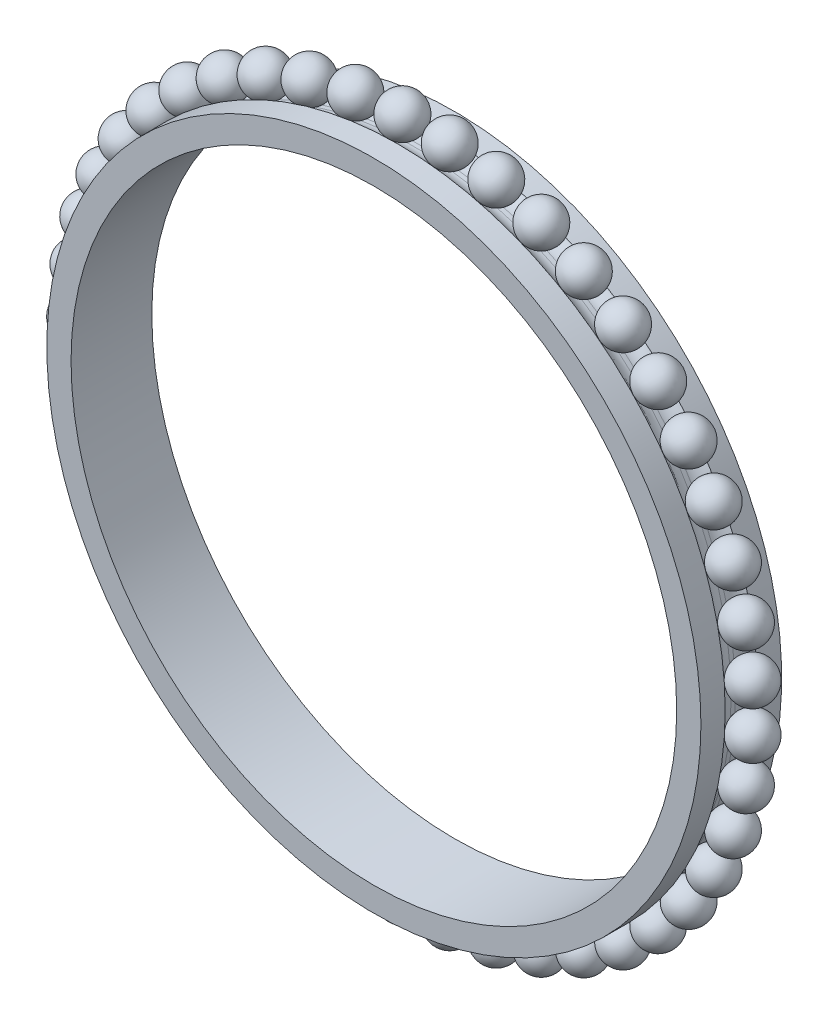
ISO-10303-21;
HEADER;
FILE_DESCRIPTION(('STEP AP214'),'2;1');
FILE_NAME('part.step','',(''),(''),'','','');
FILE_SCHEMA(('AUTOMOTIVE_DESIGN { 1 0 10303 214 1 1 1 1 }'));
ENDSEC;
DATA;
#1=APPLICATION_CONTEXT('core data for automotive mechanical design processes');
#2=APPLICATION_PROTOCOL_DEFINITION('international standard','automotive_design',2000,#1);
#3=PRODUCT_CONTEXT('',#1,'mechanical');
#4=PRODUCT('Part','Part','',(#3));
#5=PRODUCT_RELATED_PRODUCT_CATEGORY('part','',(#4));
#6=PRODUCT_DEFINITION_FORMATION('','',#4);
#7=PRODUCT_DEFINITION_CONTEXT('part definition',#1,'design');
#8=PRODUCT_DEFINITION('design','',#6,#7);
#9=PRODUCT_DEFINITION_SHAPE('','',#8);
#10=(LENGTH_UNIT() NAMED_UNIT(*) SI_UNIT(.MILLI.,.METRE.));
#11=(NAMED_UNIT(*) PLANE_ANGLE_UNIT() SI_UNIT($,.RADIAN.));
#12=(NAMED_UNIT(*) SI_UNIT($,.STERADIAN.) SOLID_ANGLE_UNIT());
#13=UNCERTAINTY_MEASURE_WITH_UNIT(LENGTH_MEASURE(1.E-05),#10,'distance_accuracy_value','');
#14=(GEOMETRIC_REPRESENTATION_CONTEXT(3) GLOBAL_UNCERTAINTY_ASSIGNED_CONTEXT((#13)) GLOBAL_UNIT_ASSIGNED_CONTEXT((#10,
#11,#12)) REPRESENTATION_CONTEXT('',''));
#15=CARTESIAN_POINT('',(0.,0.,0.));
#16=DIRECTION('',(0.,0.,1.));
#17=DIRECTION('',(1.,0.,0.));
#18=AXIS2_PLACEMENT_3D('',#15,#16,#17);
#19=CARTESIAN_POINT('',(-41.5912588871461,-5.84527024032162,5.));
#20=DIRECTION('',(-0.139173100960039,0.990268068741574,0.));
#21=DIRECTION('',(0.990268068741574,0.139173100960039,0.));
#22=AXIS2_PLACEMENT_3D('',#19,#20,#21);
#23=SPHERICAL_SURFACE('',#22,2.49999999999999);
#24=CARTESIAN_POINT('',(-39.1155887152922,-5.49733748792153,5.));
#25=VERTEX_POINT('',#24);
#26=VERTEX_LOOP('',#25);
#27=FACE_BOUND('',#26,.T.);
#28=CARTESIAN_POINT('',(-40.1058567840338,-5.63651058888157,7.00000000000001));
#29=VERTEX_POINT('',#28);
#30=VERTEX_LOOP('',#29);
#31=FACE_BOUND('',#30,.T.);
#32=CARTESIAN_POINT('',(-40.1058567840338,-5.63651058888156,3.));
#33=VERTEX_POINT('',#32);
#34=VERTEX_LOOP('',#33);
#35=FACE_BOUND('',#34,.T.);
#36=ADVANCED_FACE('F39',(#27,#31,#35),#23,.T.);
#37=CLOSED_SHELL('',(#36));
#38=MANIFOLD_SOLID_BREP('B2',#37);
#39=CARTESIAN_POINT('',(-40.3729912294097,-11.5767689443129,5.));
#40=DIRECTION('',(-0.275637355816974,0.961261695938326,0.));
#41=DIRECTION('',(0.961261695938326,0.275637355816974,0.));
#42=AXIS2_PLACEMENT_3D('',#39,#40,#41);
#43=SPHERICAL_SURFACE('',#42,2.49999999999999);
#44=CARTESIAN_POINT('',(-37.9698369895639,-10.8876755547705,5.));
#45=VERTEX_POINT('',#44);
#46=VERTEX_LOOP('',#45);
#47=FACE_BOUND('',#46,.T.);
#48=CARTESIAN_POINT('',(-38.9310986855022,-11.1633129105875,7.00000000000001));
#49=VERTEX_POINT('',#48);
#50=VERTEX_LOOP('',#49);
#51=FACE_BOUND('',#50,.T.);
#52=CARTESIAN_POINT('',(-38.9310986855022,-11.1633129105875,3.));
#53=VERTEX_POINT('',#52);
#54=VERTEX_LOOP('',#53);
#55=FACE_BOUND('',#54,.T.);
#56=ADVANCED_FACE('F69',(#47,#51,#55),#43,.T.);
#57=CLOSED_SHELL('',(#56));
#58=MANIFOLD_SOLID_BREP('B6',#57);
#59=CARTESIAN_POINT('',(-38.3689092209897,-17.0829390091826,5.));
#60=DIRECTION('',(-0.406736643075777,0.913545457642611,0.));
#61=DIRECTION('',(0.913545457642611,0.406736643075777,0.));
#62=AXIS2_PLACEMENT_3D('',#59,#60,#61);
#63=SPHERICAL_SURFACE('',#62,2.49999999999999);
#64=CARTESIAN_POINT('',(-36.0850455768831,-16.0660974014932,5.));
#65=VERTEX_POINT('',#64);
#66=VERTEX_LOOP('',#65);
#67=FACE_BOUND('',#66,.T.);
#68=CARTESIAN_POINT('',(-36.9985910345258,-16.472834044569,7.00000000000001));
#69=VERTEX_POINT('',#68);
#70=VERTEX_LOOP('',#69);
#71=FACE_BOUND('',#70,.T.);
#72=CARTESIAN_POINT('',(-36.9985910345258,-16.472834044569,3.));
#73=VERTEX_POINT('',#72);
#74=VERTEX_LOOP('',#73);
#75=FACE_BOUND('',#74,.T.);
#76=ADVANCED_FACE('F99',(#67,#71,#75),#63,.T.);
#77=CLOSED_SHELL('',(#76));
#78=MANIFOLD_SOLID_BREP('B33',#77);
#79=CARTESIAN_POINT('',(-35.6180200385704,-22.2566090977937,5.));
#80=DIRECTION('',(-0.529919264233184,0.848048096156439,0.));
#81=DIRECTION('',(0.848048096156439,0.529919264233184,0.));
#82=AXIS2_PLACEMENT_3D('',#79,#80,#81);
#83=SPHERICAL_SURFACE('',#82,2.49999999999999);
#84=CARTESIAN_POINT('',(-33.4978997981794,-20.9318109372108,5.));
#85=VERTEX_POINT('',#84);
#86=VERTEX_LOOP('',#85);
#87=FACE_BOUND('',#86,.T.);
#88=CARTESIAN_POINT('',(-34.3459478943358,-21.461730201444,7.00000000000001));
#89=VERTEX_POINT('',#88);
#90=VERTEX_LOOP('',#89);
#91=FACE_BOUND('',#90,.T.);
#92=CARTESIAN_POINT('',(-34.3459478943358,-21.461730201444,3.));
#93=VERTEX_POINT('',#92);
#94=VERTEX_LOOP('',#93);
#95=FACE_BOUND('',#94,.T.);
#96=ADVANCED_FACE('F129',(#87,#91,#95),#83,.T.);
#97=CLOSED_SHELL('',(#96));
#98=MANIFOLD_SOLID_BREP('B63',#97);
#99=CARTESIAN_POINT('',(-32.1738666109977,-26.9970796068339,5.));
#100=DIRECTION('',(-0.642787609686521,0.766044443118994,0.));
#101=DIRECTION('',(0.766044443118994,0.642787609686521,0.));
#102=AXIS2_PLACEMENT_3D('',#99,#100,#101);
#103=SPHERICAL_SURFACE('',#102,2.49999999999999);
#104=CARTESIAN_POINT('',(-30.2587555032003,-25.3901105826176,5.));
#105=VERTEX_POINT('',#104);
#106=VERTEX_LOOP('',#105);
#107=FACE_BOUND('',#106,.T.);
#108=CARTESIAN_POINT('',(-31.0247999463193,-26.0328981923041,7.00000000000001));
#109=VERTEX_POINT('',#108);
#110=VERTEX_LOOP('',#109);
#111=FACE_BOUND('',#110,.T.);
#112=CARTESIAN_POINT('',(-31.0247999463193,-26.0328981923041,3.));
#113=VERTEX_POINT('',#112);
#114=VERTEX_LOOP('',#113);
#115=FACE_BOUND('',#114,.T.);
#116=ADVANCED_FACE('F159',(#107,#111,#115),#103,.T.);
#117=CLOSED_SHELL('',(#116));
#118=MANIFOLD_SOLID_BREP('B93',#117);
#119=CARTESIAN_POINT('',(-28.1034854670728,-31.2120826700499,5.));
#120=DIRECTION('',(-0.743144825477378,0.669130606358876,0.));
#121=DIRECTION('',(0.669130606358876,0.743144825477378,0.));
#122=AXIS2_PLACEMENT_3D('',#119,#120,#121);
#123=SPHERICAL_SURFACE('',#122,2.49999999999999);
#124=CARTESIAN_POINT('',(-26.4306589511756,-29.3542206063565,5.));
#125=VERTEX_POINT('',#124);
#126=VERTEX_LOOP('',#125);
#127=FACE_BOUND('',#126,.T.);
#128=CARTESIAN_POINT('',(-27.0997895575345,-30.0973654318338,7.00000000000001));
#129=VERTEX_POINT('',#128);
#130=VERTEX_LOOP('',#129);
#131=FACE_BOUND('',#130,.T.);
#132=CARTESIAN_POINT('',(-27.0997895575345,-30.0973654318338,3.));
#133=VERTEX_POINT('',#132);
#134=VERTEX_LOOP('',#133);
#135=FACE_BOUND('',#134,.T.);
#136=ADVANCED_FACE('F189',(#127,#131,#135),#123,.T.);
#137=CLOSED_SHELL('',(#136));
#138=MANIFOLD_SOLID_BREP('B123',#137);
#139=CARTESIAN_POINT('',(-23.4861019457722,-34.8195780473112,5.));
#140=DIRECTION('',(-0.829037572555029,0.559192903470766,0.));
#141=DIRECTION('',(0.559192903470766,0.829037572555029,0.));
#142=AXIS2_PLACEMENT_3D('',#139,#140,#141);
#143=SPHERICAL_SURFACE('',#142,2.49999999999999);
#144=CARTESIAN_POINT('',(-22.0881196870953,-32.7469841159236,5.));
#145=VERTEX_POINT('',#144);
#146=VERTEX_LOOP('',#145);
#147=FACE_BOUND('',#146,.T.);
#148=CARTESIAN_POINT('',(-22.647312590566,-33.5760216884787,7.00000000000001));
#149=VERTEX_POINT('',#148);
#150=VERTEX_LOOP('',#149);
#151=FACE_BOUND('',#150,.T.);
#152=CARTESIAN_POINT('',(-22.647312590566,-33.5760216884787,3.));
#153=VERTEX_POINT('',#152);
#154=VERTEX_LOOP('',#153);
#155=FACE_BOUND('',#154,.T.);
#156=ADVANCED_FACE('F219',(#147,#151,#155),#143,.T.);
#157=CLOSED_SHELL('',(#156));
#158=MANIFOLD_SOLID_BREP('B153',#157);
#159=CARTESIAN_POINT('',(-18.4115881651421,-37.7493499445646,5.));
#160=DIRECTION('',(-0.898794046299157,0.438371146789097,0.));
#161=DIRECTION('',(0.438371146789097,0.898794046299157,0.));
#162=AXIS2_PLACEMENT_3D('',#159,#160,#161);
#163=SPHERICAL_SURFACE('',#162,2.49999999999999);
#164=CARTESIAN_POINT('',(-17.3156602981693,-35.5023648288167,5.));
#165=VERTEX_POINT('',#164);
#166=VERTEX_LOOP('',#165);
#167=FACE_BOUND('',#166,.T.);
#168=CARTESIAN_POINT('',(-17.7540314449585,-36.4011588751159,7.00000000000001));
#169=VERTEX_POINT('',#168);
#170=VERTEX_LOOP('',#169);
#171=FACE_BOUND('',#170,.T.);
#172=CARTESIAN_POINT('',(-17.7540314449584,-36.4011588751159,3.));
#173=VERTEX_POINT('',#172);
#174=VERTEX_LOOP('',#173);
#175=FACE_BOUND('',#174,.T.);
#176=ADVANCED_FACE('F249',(#167,#171,#175),#163,.T.);
#177=CLOSED_SHELL('',(#176));
#178=MANIFOLD_SOLID_BREP('B183',#177);
#179=CARTESIAN_POINT('',(-12.9787137637487,-39.9443736843962,5.));
#180=DIRECTION('',(-0.951056516295147,0.309016994374968,0.));
#181=DIRECTION('',(0.309016994374968,0.951056516295147,0.));
#182=AXIS2_PLACEMENT_3D('',#179,#180,#181);
#183=SPHERICAL_SURFACE('',#182,2.49999999999999);
#184=CARTESIAN_POINT('',(-12.2061712778113,-37.5667323936583,5.));
#185=VERTEX_POINT('',#184);
#186=VERTEX_LOOP('',#185);
#187=FACE_BOUND('',#186,.T.);
#188=CARTESIAN_POINT('',(-12.5151882721862,-38.5177889099535,7.00000000000001));
#189=VERTEX_POINT('',#188);
#190=VERTEX_LOOP('',#189);
#191=FACE_BOUND('',#190,.T.);
#192=CARTESIAN_POINT('',(-12.5151882721862,-38.5177889099534,3.));
#193=VERTEX_POINT('',#192);
#194=VERTEX_LOOP('',#193);
#195=FACE_BOUND('',#194,.T.);
#196=ADVANCED_FACE('F279',(#187,#191,#195),#183,.T.);
#197=CLOSED_SHELL('',(#196));
#198=MANIFOLD_SOLID_BREP('B213',#197);
#199=CARTESIAN_POINT('',(-7.29322346201194,-41.3619256265126,5.));
#200=DIRECTION('',(-0.984807753012204,0.173648177666951,0.));
#201=DIRECTION('',(0.173648177666951,0.984807753012204,0.));
#202=AXIS2_PLACEMENT_3D('',#199,#200,#201);
#203=SPHERICAL_SURFACE('',#202,2.49999999999999);
#204=CARTESIAN_POINT('',(-6.85910301784456,-38.8999062439821,5.));
#205=VERTEX_POINT('',#204);
#206=VERTEX_LOOP('',#205);
#207=FACE_BOUND('',#206,.T.);
#208=CARTESIAN_POINT('',(-7.03275119551152,-39.8847139969943,7.00000000000001));
#209=VERTEX_POINT('',#208);
#210=VERTEX_LOOP('',#209);
#211=FACE_BOUND('',#210,.T.);
#212=CARTESIAN_POINT('',(-7.03275119551151,-39.8847139969943,3.));
#213=VERTEX_POINT('',#212);
#214=VERTEX_LOOP('',#213);
#215=FACE_BOUND('',#214,.T.);
#216=ADVANCED_FACE('F309',(#207,#211,#215),#203,.T.);
#217=CLOSED_SHELL('',(#216));
#218=MANIFOLD_SOLID_BREP('B243',#217);
#219=CARTESIAN_POINT('',(-1.46577886150591,-41.974414734802,5.));
#220=DIRECTION('',(-0.999390827019095,0.0348994967025217,0.));
#221=DIRECTION('',(0.0348994967025217,0.999390827019095,0.));
#222=AXIS2_PLACEMENT_3D('',#219,#220,#221);
#223=SPHERICAL_SURFACE('',#222,2.49999999999999);
#224=CARTESIAN_POINT('',(-1.37853011974961,-39.4759376672543,5.));
#225=VERTEX_POINT('',#224);
#226=VERTEX_LOOP('',#225);
#227=FACE_BOUND('',#226,.T.);
#228=CARTESIAN_POINT('',(-1.41342961645213,-40.4753284942734,7.00000000000001));
#229=VERTEX_POINT('',#228);
#230=VERTEX_LOOP('',#229);
#231=FACE_BOUND('',#230,.T.);
#232=CARTESIAN_POINT('',(-1.41342961645213,-40.4753284942733,3.));
#233=VERTEX_POINT('',#232);
#234=VERTEX_LOOP('',#233);
#235=FACE_BOUND('',#234,.T.);
#236=ADVANCED_FACE('F339',(#227,#231,#235),#223,.T.);
#237=CLOSED_SHELL('',(#236));
#238=MANIFOLD_SOLID_BREP('B273',#237);
#239=CARTESIAN_POINT('',(4.39019545724062,-41.7699196054676,5.));
#240=DIRECTION('',(-0.994521895368275,-0.104528463267634,0.));
#241=DIRECTION('',(-0.104528463267634,0.994521895368275,0.));
#242=AXIS2_PLACEMENT_3D('',#239,#240,#241);
#243=SPHERICAL_SURFACE('',#242,2.49999999999999);
#244=CARTESIAN_POINT('',(4.12887429907154,-39.2836148670469,5.));
#245=VERTEX_POINT('',#244);
#246=VERTEX_LOOP('',#245);
#247=FACE_BOUND('',#246,.T.);
#248=CARTESIAN_POINT('',(4.23340276233917,-40.2781367624152,7.00000000000001));
#249=VERTEX_POINT('',#248);
#250=VERTEX_LOOP('',#249);
#251=FACE_BOUND('',#250,.T.);
#252=CARTESIAN_POINT('',(4.23340276233917,-40.2781367624152,3.));
#253=VERTEX_POINT('',#252);
#254=VERTEX_LOOP('',#253);
#255=FACE_BOUND('',#254,.T.);
#256=ADVANCED_FACE('F369',(#247,#251,#255),#243,.T.);
#257=CLOSED_SHELL('',(#256));
#258=MANIFOLD_SOLID_BREP('B303',#257);
#259=CARTESIAN_POINT('',(10.1607196151853,-40.7524205035921,5.));
#260=DIRECTION('',(-0.970295726276001,-0.241921895599649,0.));
#261=DIRECTION('',(-0.241921895599649,0.970295726276001,0.));
#262=AXIS2_PLACEMENT_3D('',#259,#260,#261);
#263=SPHERICAL_SURFACE('',#262,2.49999999999999);
#264=CARTESIAN_POINT('',(9.55591487618613,-38.3266811879021,5.));
#265=VERTEX_POINT('',#264);
#266=VERTEX_LOOP('',#265);
#267=FACE_BOUND('',#266,.T.);
#268=CARTESIAN_POINT('',(9.79783677178578,-39.2969769141781,7.00000000000001));
#269=VERTEX_POINT('',#268);
#270=VERTEX_LOOP('',#269);
#271=FACE_BOUND('',#270,.T.);
#272=CARTESIAN_POINT('',(9.79783677178578,-39.2969769141781,3.));
#273=VERTEX_POINT('',#272);
#274=VERTEX_LOOP('',#273);
#275=FACE_BOUND('',#274,.T.);
#276=ADVANCED_FACE('F399',(#267,#271,#275),#263,.T.);
#277=CLOSED_SHELL('',(#276));
#278=MANIFOLD_SOLID_BREP('B333',#277);
#279=CARTESIAN_POINT('',(15.7334769234676,-38.9417218918054,5.));
#280=DIRECTION('',(-0.927183854566795,-0.374606593415894,0.));
#281=DIRECTION('',(-0.374606593415894,0.927183854566795,0.));
#282=AXIS2_PLACEMENT_3D('',#279,#280,#281);
#283=SPHERICAL_SURFACE('',#282,2.49999999999999);
#284=CARTESIAN_POINT('',(14.7969604399278,-36.6237622553884,5.));
#285=VERTEX_POINT('',#284);
#286=VERTEX_LOOP('',#285);
#287=FACE_BOUND('',#286,.T.);
#288=CARTESIAN_POINT('',(15.1715670333437,-37.5509461099552,7.00000000000001));
#289=VERTEX_POINT('',#288);
#290=VERTEX_LOOP('',#289);
#291=FACE_BOUND('',#290,.T.);
#292=CARTESIAN_POINT('',(15.1715670333437,-37.5509461099552,3.));
#293=VERTEX_POINT('',#292);
#294=VERTEX_LOOP('',#293);
#295=FACE_BOUND('',#294,.T.);
#296=ADVANCED_FACE('F429',(#287,#291,#295),#283,.T.);
#297=CLOSED_SHELL('',(#296));
#298=MANIFOLD_SOLID_BREP('B363',#297);
#299=CARTESIAN_POINT('',(20.9999999999993,-36.3730669589468,5.));
#300=DIRECTION('',(-0.866025403784448,-0.499999999999984,0.));
#301=DIRECTION('',(-0.499999999999984,0.866025403784448,0.));
#302=AXIS2_PLACEMENT_3D('',#299,#300,#301);
#303=SPHERICAL_SURFACE('',#302,2.49999999999999);
#304=CARTESIAN_POINT('',(19.7499999999994,-34.2080034494857,5.));
#305=VERTEX_POINT('',#304);
#306=VERTEX_LOOP('',#305);
#307=FACE_BOUND('',#306,.T.);
#308=CARTESIAN_POINT('',(20.2499999999994,-35.0740288532702,7.00000000000001));
#309=VERTEX_POINT('',#308);
#310=VERTEX_LOOP('',#309);
#311=FACE_BOUND('',#310,.T.);
#312=CARTESIAN_POINT('',(20.2499999999994,-35.0740288532701,3.));
#313=VERTEX_POINT('',#312);
#314=VERTEX_LOOP('',#313);
#315=FACE_BOUND('',#314,.T.);
#316=ADVANCED_FACE('F459',(#307,#311,#315),#303,.T.);
#317=CLOSED_SHELL('',(#316));
#318=MANIFOLD_SOLID_BREP('B393',#317);
#319=CARTESIAN_POINT('',(25.8577819636771,-33.0964516514828,5.));
#320=DIRECTION('',(-0.788010753606733,-0.615661475325644,0.));
#321=DIRECTION('',(-0.615661475325644,0.788010753606733,0.));
#322=AXIS2_PLACEMENT_3D('',#319,#320,#321);
#323=SPHERICAL_SURFACE('',#322,2.49999999999999);
#324=CARTESIAN_POINT('',(24.3186282753629,-31.126424767466,5.));
#325=VERTEX_POINT('',#324);
#326=VERTEX_LOOP('',#325);
#327=FACE_BOUND('',#326,.T.);
#328=CARTESIAN_POINT('',(24.9342897506886,-31.9144355210727,7.00000000000001));
#329=VERTEX_POINT('',#328);
#330=VERTEX_LOOP('',#329);
#331=FACE_BOUND('',#330,.T.);
#332=CARTESIAN_POINT('',(24.9342897506886,-31.9144355210727,3.));
#333=VERTEX_POINT('',#332);
#334=VERTEX_LOOP('',#333);
#335=FACE_BOUND('',#334,.T.);
#336=ADVANCED_FACE('F489',(#327,#331,#335),#323,.T.);
#337=CLOSED_SHELL('',(#336));
#338=MANIFOLD_SOLID_BREP('B423',#337);
#339=CARTESIAN_POINT('',(30.2122716142229,-29.1756515592784,5.));
#340=DIRECTION('',(-0.694658370459009,-0.719339800338639,0.));
#341=DIRECTION('',(-0.719339800338639,0.694658370459009,0.));
#342=AXIS2_PLACEMENT_3D('',#339,#340,#341);
#343=SPHERICAL_SURFACE('',#342,2.49999999999999);
#344=CARTESIAN_POINT('',(28.4139221133763,-27.4390056331309,5.));
#345=VERTEX_POINT('',#344);
#346=VERTEX_LOOP('',#345);
#347=FACE_BOUND('',#346,.T.);
#348=CARTESIAN_POINT('',(29.1332619137149,-28.1336640035899,7.00000000000001));
#349=VERTEX_POINT('',#348);
#350=VERTEX_LOOP('',#349);
#351=FACE_BOUND('',#350,.T.);
#352=CARTESIAN_POINT('',(29.1332619137149,-28.1336640035899,3.));
#353=VERTEX_POINT('',#352);
#354=VERTEX_LOOP('',#353);
#355=FACE_BOUND('',#354,.T.);
#356=ADVANCED_FACE('F519',(#347,#351,#355),#343,.T.);
#357=CLOSED_SHELL('',(#356));
#358=MANIFOLD_SOLID_BREP('B453',#357);
#359=CARTESIAN_POINT('',(33.9787137637474,-24.6869805962844,5.));
#360=DIRECTION('',(-0.587785252292486,-0.809016994374938,0.));
#361=DIRECTION('',(-0.809016994374938,0.587785252292486,0.));
#362=AXIS2_PLACEMENT_3D('',#359,#360,#361);
#363=SPHERICAL_SURFACE('',#362,2.49999999999999);
#364=CARTESIAN_POINT('',(31.95617127781,-23.2175174655532,5.));
#365=VERTEX_POINT('',#364);
#366=VERTEX_LOOP('',#365);
#367=FACE_BOUND('',#366,.T.);
#368=CARTESIAN_POINT('',(32.765188272185,-23.8053027178457,7.00000000000001));
#369=VERTEX_POINT('',#368);
#370=VERTEX_LOOP('',#369);
#371=FACE_BOUND('',#370,.T.);
#372=CARTESIAN_POINT('',(32.765188272185,-23.8053027178457,3.));
#373=VERTEX_POINT('',#372);
#374=VERTEX_LOOP('',#373);
#375=FACE_BOUND('',#374,.T.);
#376=ADVANCED_FACE('F549',(#367,#371,#375),#363,.T.);
#377=CLOSED_SHELL('',(#376));
#378=MANIFOLD_SOLID_BREP('B483',#377);
#379=CARTESIAN_POINT('',(37.0837989000746,-19.717805637008,5.));
#380=DIRECTION('',(-0.469471562785905,-0.88294759285892,0.));
#381=DIRECTION('',(-0.88294759285892,0.469471562785905,0.));
#382=AXIS2_PLACEMENT_3D('',#379,#380,#381);
#383=SPHERICAL_SURFACE('',#382,2.49999999999999);
#384=CARTESIAN_POINT('',(34.8764299179273,-18.5441267300432,5.));
#385=VERTEX_POINT('',#384);
#386=VERTEX_LOOP('',#385);
#387=FACE_BOUND('',#386,.T.);
#388=CARTESIAN_POINT('',(35.7593775107863,-19.0135982928291,7.00000000000001));
#389=VERTEX_POINT('',#388);
#390=VERTEX_LOOP('',#389);
#391=FACE_BOUND('',#390,.T.);
#392=CARTESIAN_POINT('',(35.7593775107862,-19.0135982928291,3.));
#393=VERTEX_POINT('',#392);
#394=VERTEX_LOOP('',#393);
#395=FACE_BOUND('',#394,.T.);
#396=ADVANCED_FACE('F579',(#387,#391,#395),#383,.T.);
#397=CLOSED_SHELL('',(#396));
#398=MANIFOLD_SOLID_BREP('B513',#397);
#399=CARTESIAN_POINT('',(39.4670900730079,-14.3648460196787,5.));
#400=DIRECTION('',(-0.342020143325683,-0.939692620785903,0.));
#401=DIRECTION('',(-0.939692620785903,0.342020143325683,0.));
#402=AXIS2_PLACEMENT_3D('',#399,#400,#401);
#403=SPHERICAL_SURFACE('',#402,2.49999999999999);
#404=CARTESIAN_POINT('',(37.1178585210432,-13.5097956613645,5.));
#405=VERTEX_POINT('',#404);
#406=VERTEX_LOOP('',#405);
#407=FACE_BOUND('',#406,.T.);
#408=CARTESIAN_POINT('',(38.0575511418291,-13.8518158046902,7.00000000000001));
#409=VERTEX_POINT('',#408);
#410=VERTEX_LOOP('',#409);
#411=FACE_BOUND('',#410,.T.);
#412=CARTESIAN_POINT('',(38.0575511418291,-13.8518158046902,3.));
#413=VERTEX_POINT('',#412);
#414=VERTEX_LOOP('',#413);
#415=FACE_BOUND('',#414,.T.);
#416=ADVANCED_FACE('F609',(#407,#411,#415),#403,.T.);
#417=CLOSED_SHELL('',(#416));
#418=MANIFOLD_SOLID_BREP('B543',#417);
#419=CARTESIAN_POINT('',(41.0821992308197,-8.73229101434648,5.));
#420=DIRECTION('',(-0.207911690817773,-0.978147600733803,0.));
#421=DIRECTION('',(-0.978147600733803,0.207911690817773,0.));
#422=AXIS2_PLACEMENT_3D('',#419,#420,#421);
#423=SPHERICAL_SURFACE('',#422,2.49999999999999);
#424=CARTESIAN_POINT('',(38.6368302289852,-8.21251178730205,5.));
#425=VERTEX_POINT('',#424);
#426=VERTEX_LOOP('',#425);
#427=FACE_BOUND('',#426,.T.);
#428=CARTESIAN_POINT('',(39.614977829719,-8.42042347811982,7.00000000000001));
#429=VERTEX_POINT('',#428);
#430=VERTEX_LOOP('',#429);
#431=FACE_BOUND('',#430,.T.);
#432=CARTESIAN_POINT('',(39.614977829719,-8.42042347811982,3.));
#433=VERTEX_POINT('',#432);
#434=VERTEX_LOOP('',#433);
#435=FACE_BOUND('',#434,.T.);
#436=ADVANCED_FACE('F639',(#427,#431,#435),#423,.T.);
#437=CLOSED_SHELL('',(#436));
#438=MANIFOLD_SOLID_BREP('B573',#437);
#439=CARTESIAN_POINT('',(41.8976901109126,-2.92977189725386,5.));
#440=DIRECTION('',(-0.0697564737441394,-0.997564050259823,0.));
#441=DIRECTION('',(-0.997564050259823,0.0697564737441394,0.));
#442=AXIS2_PLACEMENT_3D('',#439,#440,#441);
#443=SPHERICAL_SURFACE('',#442,2.49999999999999);
#444=CARTESIAN_POINT('',(39.403779985263,-2.75538071289351,5.));
#445=VERTEX_POINT('',#444);
#446=VERTEX_LOOP('',#445);
#447=FACE_BOUND('',#446,.T.);
#448=CARTESIAN_POINT('',(40.4013440355229,-2.82513718663765,7.00000000000001));
#449=VERTEX_POINT('',#448);
#450=VERTEX_LOOP('',#449);
#451=FACE_BOUND('',#450,.T.);
#452=CARTESIAN_POINT('',(40.4013440355228,-2.82513718663765,3.));
#453=VERTEX_POINT('',#452);
#454=VERTEX_LOOP('',#453);
#455=FACE_BOUND('',#454,.T.);
#456=ADVANCED_FACE('F669',(#447,#451,#455),#443,.T.);
#457=CLOSED_SHELL('',(#456));
#458=MANIFOLD_SOLID_BREP('B603',#457);
#459=CARTESIAN_POINT('',(41.8976901109127,2.92977189725269,5.));
#460=DIRECTION('',(0.0697564737441118,-0.997564050259825,0.));
#461=DIRECTION('',(-0.997564050259825,-0.0697564737441118,0.));
#462=AXIS2_PLACEMENT_3D('',#459,#460,#461);
#463=SPHERICAL_SURFACE('',#462,2.49999999999999);
#464=CARTESIAN_POINT('',(39.4037799852631,2.75538071289242,5.));
#465=VERTEX_POINT('',#464);
#466=VERTEX_LOOP('',#465);
#467=FACE_BOUND('',#466,.T.);
#468=CARTESIAN_POINT('',(40.4013440355229,2.82513718663653,7.00000000000001));
#469=VERTEX_POINT('',#468);
#470=VERTEX_LOOP('',#469);
#471=FACE_BOUND('',#470,.T.);
#472=CARTESIAN_POINT('',(40.4013440355229,2.82513718663653,3.));
#473=VERTEX_POINT('',#472);
#474=VERTEX_LOOP('',#473);
#475=FACE_BOUND('',#474,.T.);
#476=ADVANCED_FACE('F699',(#467,#471,#475),#463,.T.);
#477=CLOSED_SHELL('',(#476));
#478=MANIFOLD_SOLID_BREP('B633',#477);
#479=CARTESIAN_POINT('',(41.0821992308199,8.73229101434536,5.));
#480=DIRECTION('',(0.207911690817747,-0.978147600733808,0.));
#481=DIRECTION('',(-0.978147600733808,-0.207911690817747,0.));
#482=AXIS2_PLACEMENT_3D('',#479,#480,#481);
#483=SPHERICAL_SURFACE('',#482,2.49999999999999);
#484=CARTESIAN_POINT('',(38.6368302289854,8.212511787301,5.));
#485=VERTEX_POINT('',#484);
#486=VERTEX_LOOP('',#485);
#487=FACE_BOUND('',#486,.T.);
#488=CARTESIAN_POINT('',(39.6149778297193,8.42042347811875,7.00000000000001));
#489=VERTEX_POINT('',#488);
#490=VERTEX_LOOP('',#489);
#491=FACE_BOUND('',#490,.T.);
#492=CARTESIAN_POINT('',(39.6149778297192,8.42042347811874,3.));
#493=VERTEX_POINT('',#492);
#494=VERTEX_LOOP('',#493);
#495=FACE_BOUND('',#494,.T.);
#496=ADVANCED_FACE('F729',(#487,#491,#495),#483,.T.);
#497=CLOSED_SHELL('',(#496));
#498=MANIFOLD_SOLID_BREP('B663',#497);
#499=CARTESIAN_POINT('',(39.4670900730083,14.3648460196776,5.));
#500=DIRECTION('',(0.342020143325657,-0.939692620785913,0.));
#501=DIRECTION('',(-0.939692620785913,-0.342020143325657,0.));
#502=AXIS2_PLACEMENT_3D('',#499,#500,#501);
#503=SPHERICAL_SURFACE('',#502,2.49999999999999);
#504=CARTESIAN_POINT('',(37.1178585210435,13.5097956613635,5.));
#505=VERTEX_POINT('',#504);
#506=VERTEX_LOOP('',#505);
#507=FACE_BOUND('',#506,.T.);
#508=CARTESIAN_POINT('',(38.0575511418295,13.8518158046891,7.00000000000001));
#509=VERTEX_POINT('',#508);
#510=VERTEX_LOOP('',#509);
#511=FACE_BOUND('',#510,.T.);
#512=CARTESIAN_POINT('',(38.0575511418295,13.8518158046891,3.));
#513=VERTEX_POINT('',#512);
#514=VERTEX_LOOP('',#513);
#515=FACE_BOUND('',#514,.T.);
#516=ADVANCED_FACE('F759',(#507,#511,#515),#503,.T.);
#517=CLOSED_SHELL('',(#516));
#518=MANIFOLD_SOLID_BREP('B693',#517);
#519=CARTESIAN_POINT('',(37.0837989000752,19.717805637007,5.));
#520=DIRECTION('',(0.46947156278588,-0.882947592858932,0.));
#521=DIRECTION('',(-0.882947592858932,-0.46947156278588,0.));
#522=AXIS2_PLACEMENT_3D('',#519,#520,#521);
#523=SPHERICAL_SURFACE('',#522,2.49999999999999);
#524=CARTESIAN_POINT('',(34.8764299179278,18.5441267300423,5.));
#525=VERTEX_POINT('',#524);
#526=VERTEX_LOOP('',#525);
#527=FACE_BOUND('',#526,.T.);
#528=CARTESIAN_POINT('',(35.7593775107868,19.0135982928282,7.00000000000001));
#529=VERTEX_POINT('',#528);
#530=VERTEX_LOOP('',#529);
#531=FACE_BOUND('',#530,.T.);
#532=CARTESIAN_POINT('',(35.7593775107868,19.0135982928282,3.));
#533=VERTEX_POINT('',#532);
#534=VERTEX_LOOP('',#533);
#535=FACE_BOUND('',#534,.T.);
#536=ADVANCED_FACE('F789',(#527,#531,#535),#523,.T.);
#537=CLOSED_SHELL('',(#536));
#538=MANIFOLD_SOLID_BREP('B723',#537);
#539=CARTESIAN_POINT('',(33.9787137637481,24.6869805962835,5.));
#540=DIRECTION('',(0.587785252292464,-0.809016994374954,0.));
#541=DIRECTION('',(-0.809016994374954,-0.587785252292464,0.));
#542=AXIS2_PLACEMENT_3D('',#539,#540,#541);
#543=SPHERICAL_SURFACE('',#542,2.49999999999999);
#544=CARTESIAN_POINT('',(31.9561712778107,23.2175174655523,5.));
#545=VERTEX_POINT('',#544);
#546=VERTEX_LOOP('',#545);
#547=FACE_BOUND('',#546,.T.);
#548=CARTESIAN_POINT('',(32.7651882721856,23.8053027178448,7.00000000000001));
#549=VERTEX_POINT('',#548);
#550=VERTEX_LOOP('',#549);
#551=FACE_BOUND('',#550,.T.);
#552=CARTESIAN_POINT('',(32.7651882721856,23.8053027178448,3.));
#553=VERTEX_POINT('',#552);
#554=VERTEX_LOOP('',#553);
#555=FACE_BOUND('',#554,.T.);
#556=ADVANCED_FACE('F819',(#547,#551,#555),#543,.T.);
#557=CLOSED_SHELL('',(#556));
#558=MANIFOLD_SOLID_BREP('B753',#557);
#559=CARTESIAN_POINT('',(30.2122716142236,29.1756515592776,5.));
#560=DIRECTION('',(0.69465837045899,-0.719339800338658,0.));
#561=DIRECTION('',(-0.719339800338658,-0.69465837045899,0.));
#562=AXIS2_PLACEMENT_3D('',#559,#560,#561);
#563=SPHERICAL_SURFACE('',#562,2.49999999999999);
#564=CARTESIAN_POINT('',(28.413922113377,27.4390056331301,5.));
#565=VERTEX_POINT('',#564);
#566=VERTEX_LOOP('',#565);
#567=FACE_BOUND('',#566,.T.);
#568=CARTESIAN_POINT('',(29.1332619137157,28.1336640035891,7.00000000000001));
#569=VERTEX_POINT('',#568);
#570=VERTEX_LOOP('',#569);
#571=FACE_BOUND('',#570,.T.);
#572=CARTESIAN_POINT('',(29.1332619137157,28.1336640035891,3.));
#573=VERTEX_POINT('',#572);
#574=VERTEX_LOOP('',#573);
#575=FACE_BOUND('',#574,.T.);
#576=ADVANCED_FACE('F849',(#567,#571,#575),#563,.T.);
#577=CLOSED_SHELL('',(#576));
#578=MANIFOLD_SOLID_BREP('B783',#577);
#579=CARTESIAN_POINT('',(25.857781963678,33.0964516514821,5.));
#580=DIRECTION('',(0.788010753606716,-0.615661475325666,0.));
#581=DIRECTION('',(-0.615661475325666,-0.788010753606716,0.));
#582=AXIS2_PLACEMENT_3D('',#579,#580,#581);
#583=SPHERICAL_SURFACE('',#582,2.49999999999999);
#584=CARTESIAN_POINT('',(24.3186282753638,31.1264247674653,5.));
#585=VERTEX_POINT('',#584);
#586=VERTEX_LOOP('',#585);
#587=FACE_BOUND('',#586,.T.);
#588=CARTESIAN_POINT('',(24.9342897506895,31.914435521072,7.00000000000001));
#589=VERTEX_POINT('',#588);
#590=VERTEX_LOOP('',#589);
#591=FACE_BOUND('',#590,.T.);
#592=CARTESIAN_POINT('',(24.9342897506895,31.914435521072,3.));
#593=VERTEX_POINT('',#592);
#594=VERTEX_LOOP('',#593);
#595=FACE_BOUND('',#594,.T.);
#596=ADVANCED_FACE('F879',(#587,#591,#595),#583,.T.);
#597=CLOSED_SHELL('',(#596));
#598=MANIFOLD_SOLID_BREP('B813',#597);
#599=CARTESIAN_POINT('',(21.0000000000003,36.3730669589462,5.));
#600=DIRECTION('',(0.866025403784434,-0.500000000000008,0.));
#601=DIRECTION('',(-0.500000000000008,-0.866025403784434,0.));
#602=AXIS2_PLACEMENT_3D('',#599,#600,#601);
#603=SPHERICAL_SURFACE('',#602,2.49999999999999);
#604=CARTESIAN_POINT('',(19.7500000000003,34.2080034494852,5.));
#605=VERTEX_POINT('',#604);
#606=VERTEX_LOOP('',#605);
#607=FACE_BOUND('',#606,.T.);
#608=CARTESIAN_POINT('',(20.2500000000003,35.0740288532696,7.00000000000001));
#609=VERTEX_POINT('',#608);
#610=VERTEX_LOOP('',#609);
#611=FACE_BOUND('',#610,.T.);
#612=CARTESIAN_POINT('',(20.2500000000003,35.0740288532696,3.));
#613=VERTEX_POINT('',#612);
#614=VERTEX_LOOP('',#613);
#615=FACE_BOUND('',#614,.T.);
#616=ADVANCED_FACE('F909',(#607,#611,#615),#603,.T.);
#617=CLOSED_SHELL('',(#616));
#618=MANIFOLD_SOLID_BREP('B843',#617);
#619=CARTESIAN_POINT('',(15.7334769234686,38.9417218918049,5.));
#620=DIRECTION('',(0.927183854566784,-0.37460659341592,0.));
#621=DIRECTION('',(-0.37460659341592,-0.927183854566784,0.));
#622=AXIS2_PLACEMENT_3D('',#619,#620,#621);
#623=SPHERICAL_SURFACE('',#622,2.49999999999999);
#624=CARTESIAN_POINT('',(14.7969604399288,36.623762255388,5.));
#625=VERTEX_POINT('',#624);
#626=VERTEX_LOOP('',#625);
#627=FACE_BOUND('',#626,.T.);
#628=CARTESIAN_POINT('',(15.1715670333448,37.5509461099548,7.00000000000001));
#629=VERTEX_POINT('',#628);
#630=VERTEX_LOOP('',#629);
#631=FACE_BOUND('',#630,.T.);
#632=CARTESIAN_POINT('',(15.1715670333448,37.5509461099548,3.));
#633=VERTEX_POINT('',#632);
#634=VERTEX_LOOP('',#633);
#635=FACE_BOUND('',#634,.T.);
#636=ADVANCED_FACE('F939',(#627,#631,#635),#623,.T.);
#637=CLOSED_SHELL('',(#636));
#638=MANIFOLD_SOLID_BREP('B873',#637);
#639=CARTESIAN_POINT('',(10.1607196151864,40.7524205035918,5.));
#640=DIRECTION('',(0.970295726275995,-0.241921895599675,0.));
#641=DIRECTION('',(-0.241921895599675,-0.970295726275995,0.));
#642=AXIS2_PLACEMENT_3D('',#639,#640,#641);
#643=SPHERICAL_SURFACE('',#642,2.49999999999999);
#644=CARTESIAN_POINT('',(9.55591487618718,38.3266811879018,5.));
#645=VERTEX_POINT('',#644);
#646=VERTEX_LOOP('',#645);
#647=FACE_BOUND('',#646,.T.);
#648=CARTESIAN_POINT('',(9.79783677178685,39.2969769141778,7.00000000000001));
#649=VERTEX_POINT('',#648);
#650=VERTEX_LOOP('',#649);
#651=FACE_BOUND('',#650,.T.);
#652=CARTESIAN_POINT('',(9.79783677178685,39.2969769141778,3.));
#653=VERTEX_POINT('',#652);
#654=VERTEX_LOOP('',#653);
#655=FACE_BOUND('',#654,.T.);
#656=ADVANCED_FACE('F969',(#647,#651,#655),#643,.T.);
#657=CLOSED_SHELL('',(#656));
#658=MANIFOLD_SOLID_BREP('B903',#657);
#659=CARTESIAN_POINT('',(4.39019545724175,41.7699196054674,5.));
#660=DIRECTION('',(0.994521895368273,-0.104528463267661,0.));
#661=DIRECTION('',(-0.104528463267661,-0.994521895368273,0.));
#662=AXIS2_PLACEMENT_3D('',#659,#660,#661);
#663=SPHERICAL_SURFACE('',#662,2.49999999999999);
#664=CARTESIAN_POINT('',(4.12887429907259,39.2836148670468,5.));
#665=VERTEX_POINT('',#664);
#666=VERTEX_LOOP('',#665);
#667=FACE_BOUND('',#666,.T.);
#668=CARTESIAN_POINT('',(4.23340276234026,40.2781367624151,7.00000000000001));
#669=VERTEX_POINT('',#668);
#670=VERTEX_LOOP('',#669);
#671=FACE_BOUND('',#670,.T.);
#672=CARTESIAN_POINT('',(4.23340276234025,40.278136762415,3.));
#673=VERTEX_POINT('',#672);
#674=VERTEX_LOOP('',#673);
#675=FACE_BOUND('',#674,.T.);
#676=ADVANCED_FACE('F999',(#667,#671,#675),#663,.T.);
#677=CLOSED_SHELL('',(#676));
#678=MANIFOLD_SOLID_BREP('B933',#677);
#679=CARTESIAN_POINT('',(-1.46577886150476,41.974414734802,5.));
#680=DIRECTION('',(0.999390827019096,0.0348994967024942,0.));
#681=DIRECTION('',(0.0348994967024942,-0.999390827019096,0.));
#682=AXIS2_PLACEMENT_3D('',#679,#680,#681);
#683=SPHERICAL_SURFACE('',#682,2.49999999999999);
#684=CARTESIAN_POINT('',(-1.37853011974852,39.4759376672543,5.));
#685=VERTEX_POINT('',#684);
#686=VERTEX_LOOP('',#685);
#687=FACE_BOUND('',#686,.T.);
#688=CARTESIAN_POINT('',(-1.41342961645102,40.4753284942734,7.00000000000001));
#689=VERTEX_POINT('',#688);
#690=VERTEX_LOOP('',#689);
#691=FACE_BOUND('',#690,.T.);
#692=CARTESIAN_POINT('',(-1.41342961645102,40.4753284942734,3.));
#693=VERTEX_POINT('',#692);
#694=VERTEX_LOOP('',#693);
#695=FACE_BOUND('',#694,.T.);
#696=ADVANCED_FACE('F1029',(#687,#691,#695),#683,.T.);
#697=CLOSED_SHELL('',(#696));
#698=MANIFOLD_SOLID_BREP('B963',#697);
#699=CARTESIAN_POINT('',(-7.29322346201082,41.3619256265128,5.));
#700=DIRECTION('',(0.984807753012209,0.173648177666924,0.));
#701=DIRECTION('',(0.173648177666924,-0.984807753012209,0.));
#702=AXIS2_PLACEMENT_3D('',#699,#700,#701);
#703=SPHERICAL_SURFACE('',#702,2.49999999999999);
#704=CARTESIAN_POINT('',(-6.85910301784351,38.8999062439823,5.));
#705=VERTEX_POINT('',#704);
#706=VERTEX_LOOP('',#705);
#707=FACE_BOUND('',#706,.T.);
#708=CARTESIAN_POINT('',(-7.03275119551044,39.8847139969945,7.00000000000001));
#709=VERTEX_POINT('',#708);
#710=VERTEX_LOOP('',#709);
#711=FACE_BOUND('',#710,.T.);
#712=CARTESIAN_POINT('',(-7.03275119551043,39.8847139969945,3.));
#713=VERTEX_POINT('',#712);
#714=VERTEX_LOOP('',#713);
#715=FACE_BOUND('',#714,.T.);
#716=ADVANCED_FACE('F1059',(#707,#711,#715),#703,.T.);
#717=CLOSED_SHELL('',(#716));
#718=MANIFOLD_SOLID_BREP('B993',#717);
#719=CARTESIAN_POINT('',(-12.9787137637476,39.9443736843965,5.));
#720=DIRECTION('',(0.951056516295155,0.309016994374942,0.));
#721=DIRECTION('',(0.309016994374942,-0.951056516295155,0.));
#722=AXIS2_PLACEMENT_3D('',#719,#720,#721);
#723=SPHERICAL_SURFACE('',#722,2.49999999999999);
#724=CARTESIAN_POINT('',(-12.2061712778102,37.5667323936586,5.));
#725=VERTEX_POINT('',#724);
#726=VERTEX_LOOP('',#725);
#727=FACE_BOUND('',#726,.T.);
#728=CARTESIAN_POINT('',(-12.5151882721852,38.5177889099538,7.00000000000001));
#729=VERTEX_POINT('',#728);
#730=VERTEX_LOOP('',#729);
#731=FACE_BOUND('',#730,.T.);
#732=CARTESIAN_POINT('',(-12.5151882721852,38.5177889099538,3.));
#733=VERTEX_POINT('',#732);
#734=VERTEX_LOOP('',#733);
#735=FACE_BOUND('',#734,.T.);
#736=ADVANCED_FACE('F1089',(#727,#731,#735),#723,.T.);
#737=CLOSED_SHELL('',(#736));
#738=MANIFOLD_SOLID_BREP('B1023',#737);
#739=CARTESIAN_POINT('',(-18.4115881651411,37.7493499445651,5.));
#740=DIRECTION('',(0.898794046299169,0.438371146789073,0.));
#741=DIRECTION('',(0.438371146789073,-0.898794046299169,0.));
#742=AXIS2_PLACEMENT_3D('',#739,#740,#741);
#743=SPHERICAL_SURFACE('',#742,2.49999999999999);
#744=CARTESIAN_POINT('',(-17.3156602981684,35.5023648288172,5.));
#745=VERTEX_POINT('',#744);
#746=VERTEX_LOOP('',#745);
#747=FACE_BOUND('',#746,.T.);
#748=CARTESIAN_POINT('',(-17.7540314449575,36.4011588751164,7.00000000000001));
#749=VERTEX_POINT('',#748);
#750=VERTEX_LOOP('',#749);
#751=FACE_BOUND('',#750,.T.);
#752=CARTESIAN_POINT('',(-17.7540314449575,36.4011588751164,3.));
#753=VERTEX_POINT('',#752);
#754=VERTEX_LOOP('',#753);
#755=FACE_BOUND('',#754,.T.);
#756=ADVANCED_FACE('F1119',(#747,#751,#755),#743,.T.);
#757=CLOSED_SHELL('',(#756));
#758=MANIFOLD_SOLID_BREP('B1053',#757);
#759=CARTESIAN_POINT('',(-23.4861019457712,34.8195780473118,5.));
#760=DIRECTION('',(0.829037572555044,0.559192903470743,0.));
#761=DIRECTION('',(0.559192903470743,-0.829037572555044,0.));
#762=AXIS2_PLACEMENT_3D('',#759,#760,#761);
#763=SPHERICAL_SURFACE('',#762,2.49999999999999);
#764=CARTESIAN_POINT('',(-22.0881196870944,32.7469841159242,5.));
#765=VERTEX_POINT('',#764);
#766=VERTEX_LOOP('',#765);
#767=FACE_BOUND('',#766,.T.);
#768=CARTESIAN_POINT('',(-22.6473125905651,33.5760216884793,7.00000000000001));
#769=VERTEX_POINT('',#768);
#770=VERTEX_LOOP('',#769);
#771=FACE_BOUND('',#770,.T.);
#772=CARTESIAN_POINT('',(-22.6473125905651,33.5760216884793,3.));
#773=VERTEX_POINT('',#772);
#774=VERTEX_LOOP('',#773);
#775=FACE_BOUND('',#774,.T.);
#776=ADVANCED_FACE('F1149',(#767,#771,#775),#763,.T.);
#777=CLOSED_SHELL('',(#776));
#778=MANIFOLD_SOLID_BREP('B1083',#777);
#779=CARTESIAN_POINT('',(-28.1034854670719,31.2120826700507,5.));
#780=DIRECTION('',(0.743144825477397,0.669130606358856,0.));
#781=DIRECTION('',(0.669130606358856,-0.743144825477397,0.));
#782=AXIS2_PLACEMENT_3D('',#779,#780,#781);
#783=SPHERICAL_SURFACE('',#782,2.49999999999999);
#784=CARTESIAN_POINT('',(-26.4306589511748,29.3542206063572,5.));
#785=VERTEX_POINT('',#784);
#786=VERTEX_LOOP('',#785);
#787=FACE_BOUND('',#786,.T.);
#788=CARTESIAN_POINT('',(-27.0997895575337,30.0973654318346,7.00000000000001));
#789=VERTEX_POINT('',#788);
#790=VERTEX_LOOP('',#789);
#791=FACE_BOUND('',#790,.T.);
#792=CARTESIAN_POINT('',(-27.0997895575337,30.0973654318346,3.));
#793=VERTEX_POINT('',#792);
#794=VERTEX_LOOP('',#793);
#795=FACE_BOUND('',#794,.T.);
#796=ADVANCED_FACE('F1179',(#787,#791,#795),#783,.T.);
#797=CLOSED_SHELL('',(#796));
#798=MANIFOLD_SOLID_BREP('B1113',#797);
#799=CARTESIAN_POINT('',(-32.173866610997,26.9970796068347,5.));
#800=DIRECTION('',(0.642787609686542,0.766044443118976,0.));
#801=DIRECTION('',(0.766044443118976,-0.642787609686542,0.));
#802=AXIS2_PLACEMENT_3D('',#799,#800,#801);
#803=SPHERICAL_SURFACE('',#802,2.49999999999999);
#804=CARTESIAN_POINT('',(-30.2587555031996,25.3901105826184,5.));
#805=VERTEX_POINT('',#804);
#806=VERTEX_LOOP('',#805);
#807=FACE_BOUND('',#806,.T.);
#808=CARTESIAN_POINT('',(-31.0247999463185,26.0328981923049,7.00000000000001));
#809=VERTEX_POINT('',#808);
#810=VERTEX_LOOP('',#809);
#811=FACE_BOUND('',#810,.T.);
#812=CARTESIAN_POINT('',(-31.0247999463185,26.0328981923049,3.));
#813=VERTEX_POINT('',#812);
#814=VERTEX_LOOP('',#813);
#815=FACE_BOUND('',#814,.T.);
#816=ADVANCED_FACE('F1209',(#807,#811,#815),#803,.T.);
#817=CLOSED_SHELL('',(#816));
#818=MANIFOLD_SOLID_BREP('B1143',#817);
#819=CARTESIAN_POINT('',(-35.6180200385698,22.2566090977947,5.));
#820=DIRECTION('',(0.529919264233207,0.848048096156425,0.));
#821=DIRECTION('',(0.848048096156425,-0.529919264233207,0.));
#822=AXIS2_PLACEMENT_3D('',#819,#820,#821);
#823=SPHERICAL_SURFACE('',#822,2.49999999999999);
#824=CARTESIAN_POINT('',(-33.4978997981788,20.9318109372117,5.));
#825=VERTEX_POINT('',#824);
#826=VERTEX_LOOP('',#825);
#827=FACE_BOUND('',#826,.T.);
#828=CARTESIAN_POINT('',(-34.3459478943352,21.4617302014449,7.00000000000001));
#829=VERTEX_POINT('',#828);
#830=VERTEX_LOOP('',#829);
#831=FACE_BOUND('',#830,.T.);
#832=CARTESIAN_POINT('',(-34.3459478943352,21.4617302014449,3.));
#833=VERTEX_POINT('',#832);
#834=VERTEX_LOOP('',#833);
#835=FACE_BOUND('',#834,.T.);
#836=ADVANCED_FACE('F1239',(#827,#831,#835),#823,.T.);
#837=CLOSED_SHELL('',(#836));
#838=MANIFOLD_SOLID_BREP('B1173',#837);
#839=CARTESIAN_POINT('',(-38.3689092209892,17.0829390091837,5.));
#840=DIRECTION('',(0.406736643075802,0.9135454576426,0.));
#841=DIRECTION('',(0.9135454576426,-0.406736643075802,0.));
#842=AXIS2_PLACEMENT_3D('',#839,#840,#841);
#843=SPHERICAL_SURFACE('',#842,2.49999999999999);
#844=CARTESIAN_POINT('',(-36.0850455768827,16.0660974014942,5.));
#845=VERTEX_POINT('',#844);
#846=VERTEX_LOOP('',#845);
#847=FACE_BOUND('',#846,.T.);
#848=CARTESIAN_POINT('',(-36.9985910345253,16.47283404457,7.00000000000001));
#849=VERTEX_POINT('',#848);
#850=VERTEX_LOOP('',#849);
#851=FACE_BOUND('',#850,.T.);
#852=CARTESIAN_POINT('',(-36.9985910345253,16.47283404457,3.));
#853=VERTEX_POINT('',#852);
#854=VERTEX_LOOP('',#853);
#855=FACE_BOUND('',#854,.T.);
#856=ADVANCED_FACE('F1269',(#847,#851,#855),#843,.T.);
#857=CLOSED_SHELL('',(#856));
#858=MANIFOLD_SOLID_BREP('B1203',#857);
#859=CARTESIAN_POINT('',(-40.3729912294094,11.576768944314,5.));
#860=DIRECTION('',(0.275637355817,0.961261695938319,0.));
#861=DIRECTION('',(0.961261695938319,-0.275637355817,0.));
#862=AXIS2_PLACEMENT_3D('',#859,#860,#861);
#863=SPHERICAL_SURFACE('',#862,2.49999999999999);
#864=CARTESIAN_POINT('',(-37.9698369895636,10.8876755547715,5.));
#865=VERTEX_POINT('',#864);
#866=VERTEX_LOOP('',#865);
#867=FACE_BOUND('',#866,.T.);
#868=CARTESIAN_POINT('',(-38.9310986855019,11.1633129105885,7.00000000000001));
#869=VERTEX_POINT('',#868);
#870=VERTEX_LOOP('',#869);
#871=FACE_BOUND('',#870,.T.);
#872=CARTESIAN_POINT('',(-38.9310986855019,11.1633129105885,3.));
#873=VERTEX_POINT('',#872);
#874=VERTEX_LOOP('',#873);
#875=FACE_BOUND('',#874,.T.);
#876=ADVANCED_FACE('F1299',(#867,#871,#875),#863,.T.);
#877=CLOSED_SHELL('',(#876));
#878=MANIFOLD_SOLID_BREP('B1233',#877);
#879=CARTESIAN_POINT('',(-41.5912588871459,5.84527024032277,5.));
#880=DIRECTION('',(0.139173100960066,0.99026806874157,0.));
#881=DIRECTION('',(0.99026806874157,-0.139173100960066,0.));
#882=AXIS2_PLACEMENT_3D('',#879,#880,#881);
#883=SPHERICAL_SURFACE('',#882,2.49999999999999);
#884=CARTESIAN_POINT('',(-39.115588715292,5.49733748792261,5.));
#885=VERTEX_POINT('',#884);
#886=VERTEX_LOOP('',#885);
#887=FACE_BOUND('',#886,.T.);
#888=CARTESIAN_POINT('',(-40.1058567840336,5.63651058888268,7.00000000000001));
#889=VERTEX_POINT('',#888);
#890=VERTEX_LOOP('',#889);
#891=FACE_BOUND('',#890,.T.);
#892=CARTESIAN_POINT('',(-40.1058567840336,5.63651058888268,3.));
#893=VERTEX_POINT('',#892);
#894=VERTEX_LOOP('',#893);
#895=FACE_BOUND('',#894,.T.);
#896=ADVANCED_FACE('F1329',(#887,#891,#895),#883,.T.);
#897=CLOSED_SHELL('',(#896));
#898=MANIFOLD_SOLID_BREP('B1263',#897);
#899=CARTESIAN_POINT('',(-42.,0.,5.));
#900=DIRECTION('',(0.,1.,0.));
#901=DIRECTION('',(1.,0.,0.));
#902=AXIS2_PLACEMENT_3D('',#899,#900,#901);
#903=SPHERICAL_SURFACE('',#902,2.49999999999999);
#904=CARTESIAN_POINT('',(-39.5,0.,5.));
#905=VERTEX_POINT('',#904);
#906=VERTEX_LOOP('',#905);
#907=FACE_BOUND('',#906,.T.);
#908=CARTESIAN_POINT('',(-40.5,0.,7.00000000000001));
#909=VERTEX_POINT('',#908);
#910=VERTEX_LOOP('',#909);
#911=FACE_BOUND('',#910,.T.);
#912=CARTESIAN_POINT('',(-40.5,0.,3.));
#913=VERTEX_POINT('',#912);
#914=VERTEX_LOOP('',#913);
#915=FACE_BOUND('',#914,.T.);
#916=ADVANCED_FACE('F1360',(#907,#911,#915),#903,.T.);
#917=CLOSED_SHELL('',(#916));
#918=MANIFOLD_SOLID_BREP('B1293',#917);
#919=CARTESIAN_POINT('',(0.,0.,10.));
#920=DIRECTION('',(0.,0.,-1.));
#921=DIRECTION('',(-1.,0.,0.));
#922=AXIS2_PLACEMENT_3D('',#919,#920,#921);
#923=CYLINDRICAL_SURFACE('',#922,39.5);
#924=CARTESIAN_POINT('',(0.,0.,4.73205080756888));
#925=DIRECTION('',(0.,0.,-1.));
#926=DIRECTION('',(-1.,0.,0.));
#927=AXIS2_PLACEMENT_3D('',#924,#925,#926);
#928=CIRCLE('',#927,39.5);
#929=CARTESIAN_POINT('',(-39.5,0.,4.73205080756888));
#930=VERTEX_POINT('',#929);
#931=EDGE_CURVE('E1358',#930,#930,#928,.F.);
#932=ORIENTED_EDGE('',*,*,#931,.T.);
#933=EDGE_LOOP('',(#932));
#934=FACE_BOUND('',#933,.T.);
#935=CARTESIAN_POINT('',(-39.5,0.,5.));
#936=VERTEX_POINT('',#935);
#937=VERTEX_LOOP('',#936);
#938=FACE_BOUND('',#937,.T.);
#939=CARTESIAN_POINT('',(0.,0.,5.26794919243112));
#940=DIRECTION('',(0.,0.,1.));
#941=DIRECTION('',(1.,0.,0.));
#942=AXIS2_PLACEMENT_3D('',#939,#940,#941);
#943=CIRCLE('',#942,39.5);
#944=CARTESIAN_POINT('',(39.5,0.,5.26794919243112));
#945=VERTEX_POINT('',#944);
#946=EDGE_CURVE('E1390',#945,#945,#943,.F.);
#947=ORIENTED_EDGE('',*,*,#946,.T.);
#948=EDGE_LOOP('',(#947));
#949=FACE_BOUND('',#948,.T.);
#950=ADVANCED_FACE('F1382',(#934,#938,#949),#923,.T.);
#951=CARTESIAN_POINT('',(0.,0.,10.));
#952=DIRECTION('',(0.,0.,1.));
#953=DIRECTION('',(1.,0.,0.));
#954=AXIS2_PLACEMENT_3D('',#951,#952,#953);
#955=PLANE('',#954);
#956=CARTESIAN_POINT('',(0.,0.,10.));
#957=DIRECTION('',(0.,0.,1.));
#958=DIRECTION('',(1.,0.,0.));
#959=AXIS2_PLACEMENT_3D('',#956,#957,#958);
#960=CIRCLE('',#959,37.5);
#961=CARTESIAN_POINT('',(37.5,0.,10.));
#962=VERTEX_POINT('',#961);
#963=EDGE_CURVE('E1406',#962,#962,#960,.T.);
#964=ORIENTED_EDGE('',*,*,#963,.F.);
#965=EDGE_LOOP('',(#964));
#966=FACE_BOUND('',#965,.T.);
#967=CARTESIAN_POINT('',(0.,0.,10.));
#968=DIRECTION('',(0.,0.,1.));
#969=DIRECTION('',(1.,0.,0.));
#970=AXIS2_PLACEMENT_3D('',#967,#968,#969);
#971=CIRCLE('',#970,40.5);
#972=CARTESIAN_POINT('',(40.5,0.,10.));
#973=VERTEX_POINT('',#972);
#974=EDGE_CURVE('E1413',#973,#973,#971,.T.);
#975=ORIENTED_EDGE('',*,*,#974,.T.);
#976=EDGE_LOOP('',(#975));
#977=FACE_BOUND('',#976,.T.);
#978=ADVANCED_FACE('F1400',(#966,#977),#955,.T.);
#979=CARTESIAN_POINT('',(0.,0.,0.));
#980=DIRECTION('',(0.,0.,1.));
#981=DIRECTION('',(1.,0.,0.));
#982=AXIS2_PLACEMENT_3D('',#979,#980,#981);
#983=PLANE('',#982);
#984=CARTESIAN_POINT('',(0.,0.,0.));
#985=DIRECTION('',(0.,0.,1.));
#986=DIRECTION('',(1.,0.,0.));
#987=AXIS2_PLACEMENT_3D('',#984,#985,#986);
#988=CIRCLE('',#987,37.5);
#989=CARTESIAN_POINT('',(37.5,0.,0.));
#990=VERTEX_POINT('',#989);
#991=EDGE_CURVE('E1408',#990,#990,#988,.T.);
#992=ORIENTED_EDGE('',*,*,#991,.T.);
#993=EDGE_LOOP('',(#992));
#994=FACE_BOUND('',#993,.T.);
#995=CARTESIAN_POINT('',(0.,0.,0.));
#996=DIRECTION('',(0.,0.,-1.));
#997=DIRECTION('',(-1.,0.,0.));
#998=AXIS2_PLACEMENT_3D('',#995,#996,#997);
#999=CIRCLE('',#998,40.5);
#1000=CARTESIAN_POINT('',(-40.5,0.,0.));
#1001=VERTEX_POINT('',#1000);
#1002=EDGE_CURVE('E1418',#1001,#1001,#999,.T.);
#1003=ORIENTED_EDGE('',*,*,#1002,.T.);
#1004=EDGE_LOOP('',(#1003));
#1005=FACE_BOUND('',#1004,.T.);
#1006=ADVANCED_FACE('F1446',(#994,#1005),#983,.F.);
#1007=CARTESIAN_POINT('',(0.,0.,10.));
#1008=DIRECTION('',(0.,0.,-1.));
#1009=DIRECTION('',(-1.,0.,0.));
#1010=AXIS2_PLACEMENT_3D('',#1007,#1008,#1009);
#1011=CYLINDRICAL_SURFACE('',#1010,37.5);
#1012=ORIENTED_EDGE('',*,*,#963,.T.);
#1013=EDGE_LOOP('',(#1012));
#1014=FACE_BOUND('',#1013,.T.);
#1015=ORIENTED_EDGE('',*,*,#991,.F.);
#1016=EDGE_LOOP('',(#1015));
#1017=FACE_BOUND('',#1016,.T.);
#1018=ADVANCED_FACE('F1442',(#1014,#1017),#1011,.F.);
#1019=CARTESIAN_POINT('',(0.,0.,7.));
#1020=DIRECTION('',(0.,0.,1.));
#1021=DIRECTION('',(1.,0.,0.));
#1022=AXIS2_PLACEMENT_3D('',#1019,#1020,#1021);
#1023=CYLINDRICAL_SURFACE('',#1022,40.5);
#1024=CARTESIAN_POINT('',(0.,0.,7.));
#1025=DIRECTION('',(0.,0.,1.));
#1026=DIRECTION('',(1.,0.,0.));
#1027=AXIS2_PLACEMENT_3D('',#1024,#1025,#1026);
#1028=CIRCLE('',#1027,40.5);
#1029=CARTESIAN_POINT('',(-40.5,0.,7.));
#1030=VERTEX_POINT('',#1029);
#1031=EDGE_CURVE('E1395',#1030,#1030,#1028,.T.);
#1032=ORIENTED_EDGE('',*,*,#1031,.T.);
#1033=EDGE_LOOP('',(#1032));
#1034=FACE_BOUND('',#1033,.T.);
#1035=ORIENTED_EDGE('',*,*,#974,.F.);
#1036=EDGE_LOOP('',(#1035));
#1037=FACE_BOUND('',#1036,.T.);
#1038=ADVANCED_FACE('F1438',(#1034,#1037),#1023,.T.);
#1039=CARTESIAN_POINT('',(0.,0.,5.26794919243112));
#1040=DIRECTION('',(0.,0.,1.));
#1041=DIRECTION('',(1.,0.,0.));
#1042=AXIS2_PLACEMENT_3D('',#1039,#1040,#1041);
#1043=TOROIDAL_SURFACE('',#1042,41.5,2.);
#1044=ORIENTED_EDGE('',*,*,#946,.F.);
#1045=EDGE_LOOP('',(#1044));
#1046=FACE_BOUND('',#1045,.T.);
#1047=ORIENTED_EDGE('',*,*,#1031,.F.);
#1048=EDGE_LOOP('',(#1047));
#1049=FACE_BOUND('',#1048,.T.);
#1050=ADVANCED_FACE('F1432',(#1046,#1049),#1043,.F.);
#1051=CARTESIAN_POINT('',(0.,0.,3.));
#1052=DIRECTION('',(0.,0.,-1.));
#1053=DIRECTION('',(-1.,0.,0.));
#1054=AXIS2_PLACEMENT_3D('',#1051,#1052,#1053);
#1055=CYLINDRICAL_SURFACE('',#1054,40.5);
#1056=CARTESIAN_POINT('',(0.,0.,3.));
#1057=DIRECTION('',(0.,0.,-1.));
#1058=DIRECTION('',(-1.,0.,0.));
#1059=AXIS2_PLACEMENT_3D('',#1056,#1057,#1058);
#1060=CIRCLE('',#1059,40.5);
#1061=CARTESIAN_POINT('',(-40.5,0.,3.));
#1062=VERTEX_POINT('',#1061);
#1063=EDGE_CURVE('E1416',#1062,#1062,#1060,.T.);
#1064=ORIENTED_EDGE('',*,*,#1063,.T.);
#1065=EDGE_LOOP('',(#1064));
#1066=FACE_BOUND('',#1065,.T.);
#1067=ORIENTED_EDGE('',*,*,#1002,.F.);
#1068=EDGE_LOOP('',(#1067));
#1069=FACE_BOUND('',#1068,.T.);
#1070=ADVANCED_FACE('F1424',(#1066,#1069),#1055,.T.);
#1071=CARTESIAN_POINT('',(0.,0.,4.73205080756888));
#1072=DIRECTION('',(0.,0.,-1.));
#1073=DIRECTION('',(-1.,0.,0.));
#1074=AXIS2_PLACEMENT_3D('',#1071,#1072,#1073);
#1075=TOROIDAL_SURFACE('',#1074,41.5,2.);
#1076=ORIENTED_EDGE('',*,*,#931,.F.);
#1077=EDGE_LOOP('',(#1076));
#1078=FACE_BOUND('',#1077,.T.);
#1079=ORIENTED_EDGE('',*,*,#1063,.F.);
#1080=EDGE_LOOP('',(#1079));
#1081=FACE_BOUND('',#1080,.T.);
#1082=ADVANCED_FACE('F1384',(#1078,#1081),#1075,.F.);
#1083=CLOSED_SHELL('',(#950,#978,#1006,#1018,#1038,#1050,#1070,#1082));
#1084=MANIFOLD_SOLID_BREP('B1323',#1083);
#1085=ADVANCED_BREP_SHAPE_REPRESENTATION('',(#18,#38,#58,#78,#98,#118,#138,#158,#178,#198,#218,
#238,#258,#278,#298,#318,#338,#358,#378,#398,#418,#438,#458,#478,#498,#518,#538,#558,#578,#598,
#618,#638,#658,#678,#698,#718,#738,#758,#778,#798,#818,#838,#858,#878,#898,#918,#1084),#14);
#1086=SHAPE_DEFINITION_REPRESENTATION(#9,#1085);
ENDSEC;
END-ISO-10303-21;
